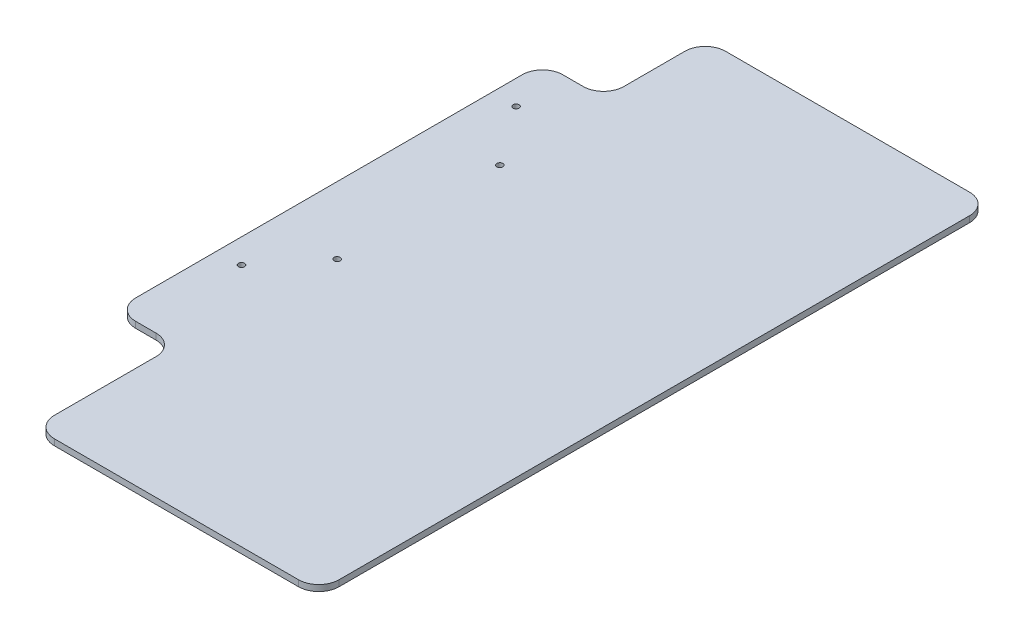
ISO-10303-21;
HEADER;
FILE_DESCRIPTION(('STEP AP214'),'2;1');
FILE_NAME('part.step','',(''),(''),'','','');
FILE_SCHEMA(('AUTOMOTIVE_DESIGN { 1 0 10303 214 1 1 1 1 }'));
ENDSEC;
DATA;
#1=APPLICATION_CONTEXT('core data for automotive mechanical design processes');
#2=APPLICATION_PROTOCOL_DEFINITION('international standard','automotive_design',2000,#1);
#3=PRODUCT_CONTEXT('',#1,'mechanical');
#4=PRODUCT('Part','Part','',(#3));
#5=PRODUCT_RELATED_PRODUCT_CATEGORY('part','',(#4));
#6=PRODUCT_DEFINITION_FORMATION('','',#4);
#7=PRODUCT_DEFINITION_CONTEXT('part definition',#1,'design');
#8=PRODUCT_DEFINITION('design','',#6,#7);
#9=PRODUCT_DEFINITION_SHAPE('','',#8);
#10=(LENGTH_UNIT() NAMED_UNIT(*) SI_UNIT(.MILLI.,.METRE.));
#11=(NAMED_UNIT(*) PLANE_ANGLE_UNIT() SI_UNIT($,.RADIAN.));
#12=(NAMED_UNIT(*) SI_UNIT($,.STERADIAN.) SOLID_ANGLE_UNIT());
#13=UNCERTAINTY_MEASURE_WITH_UNIT(LENGTH_MEASURE(1.E-05),#10,'distance_accuracy_value','');
#14=(GEOMETRIC_REPRESENTATION_CONTEXT(3) GLOBAL_UNCERTAINTY_ASSIGNED_CONTEXT((#13)) GLOBAL_UNIT_ASSIGNED_CONTEXT((#10,
#11,#12)) REPRESENTATION_CONTEXT('',''));
#15=CARTESIAN_POINT('',(0.,0.,0.));
#16=DIRECTION('',(0.,0.,1.));
#17=DIRECTION('',(1.,0.,0.));
#18=AXIS2_PLACEMENT_3D('',#15,#16,#17);
#19=CARTESIAN_POINT('',(0.,3.,-220.));
#20=DIRECTION('',(0.,0.,1.));
#21=DIRECTION('',(1.,0.,0.));
#22=AXIS2_PLACEMENT_3D('',#19,#20,#21);
#23=PLANE('',#22);
#24=DIRECTION('',(-1.,0.,0.));
#25=VECTOR('',#24,1.);
#26=CARTESIAN_POINT('',(0.,0.,-220.));
#27=LINE('',#26,#25);
#28=CARTESIAN_POINT('',(20.,0.,-220.));
#29=VERTEX_POINT('',#28);
#30=CARTESIAN_POINT('',(10.,0.,-220.));
#31=VERTEX_POINT('',#30);
#32=EDGE_CURVE('E236',#29,#31,#27,.T.);
#33=ORIENTED_EDGE('',*,*,#32,.T.);
#34=DIRECTION('',(0.,-1.,0.));
#35=VECTOR('',#34,1.);
#36=CARTESIAN_POINT('',(10.,3.,-220.));
#37=LINE('',#36,#35);
#38=CARTESIAN_POINT('',(10.,3.,-220.));
#39=VERTEX_POINT('',#38);
#40=EDGE_CURVE('E201',#31,#39,#37,.F.);
#41=ORIENTED_EDGE('',*,*,#40,.T.);
#42=DIRECTION('',(-1.,0.,0.));
#43=VECTOR('',#42,1.);
#44=CARTESIAN_POINT('',(0.,3.,-220.));
#45=LINE('',#44,#43);
#46=CARTESIAN_POINT('',(20.,3.,-220.));
#47=VERTEX_POINT('',#46);
#48=EDGE_CURVE('E161',#47,#39,#45,.T.);
#49=ORIENTED_EDGE('',*,*,#48,.F.);
#50=DIRECTION('',(0.,1.,0.));
#51=VECTOR('',#50,1.);
#52=CARTESIAN_POINT('',(20.,3.,-220.));
#53=LINE('',#52,#51);
#54=EDGE_CURVE('E199',#47,#29,#53,.F.);
#55=ORIENTED_EDGE('',*,*,#54,.T.);
#56=EDGE_LOOP('',(#33,#41,#49,#55));
#57=FACE_BOUND('',#56,.T.);
#58=ADVANCED_FACE('F35',(#57),#23,.F.);
#59=CARTESIAN_POINT('',(0.,3.,0.));
#60=DIRECTION('',(1.,0.,0.));
#61=DIRECTION('',(0.,0.,-1.));
#62=AXIS2_PLACEMENT_3D('',#59,#60,#61);
#63=PLANE('',#62);
#64=DIRECTION('',(0.,0.,1.));
#65=VECTOR('',#64,1.);
#66=CARTESIAN_POINT('',(0.,0.,0.));
#67=LINE('',#66,#65);
#68=CARTESIAN_POINT('',(0.,0.,-210.));
#69=VERTEX_POINT('',#68);
#70=CARTESIAN_POINT('',(0.,0.,-20.));
#71=VERTEX_POINT('',#70);
#72=EDGE_CURVE('E273',#69,#71,#67,.T.);
#73=ORIENTED_EDGE('',*,*,#72,.T.);
#74=DIRECTION('',(0.,1.,0.));
#75=VECTOR('',#74,1.);
#76=CARTESIAN_POINT('',(0.,3.,-20.));
#77=LINE('',#76,#75);
#78=CARTESIAN_POINT('',(0.,3.,-20.));
#79=VERTEX_POINT('',#78);
#80=EDGE_CURVE('E196',#71,#79,#77,.T.);
#81=ORIENTED_EDGE('',*,*,#80,.T.);
#82=DIRECTION('',(0.,0.,1.));
#83=VECTOR('',#82,1.);
#84=CARTESIAN_POINT('',(0.,3.,0.));
#85=LINE('',#84,#83);
#86=CARTESIAN_POINT('',(0.,3.,-210.));
#87=VERTEX_POINT('',#86);
#88=EDGE_CURVE('E276',#87,#79,#85,.T.);
#89=ORIENTED_EDGE('',*,*,#88,.F.);
#90=DIRECTION('',(0.,-1.,0.));
#91=VECTOR('',#90,1.);
#92=CARTESIAN_POINT('',(0.,3.,-210.));
#93=LINE('',#92,#91);
#94=EDGE_CURVE('E193',#87,#69,#93,.T.);
#95=ORIENTED_EDGE('',*,*,#94,.T.);
#96=EDGE_LOOP('',(#73,#81,#89,#95));
#97=FACE_BOUND('',#96,.T.);
#98=ADVANCED_FACE('F313',(#97),#63,.F.);
#99=CARTESIAN_POINT('',(170.,3.,0.));
#100=DIRECTION('',(-1.,0.,0.));
#101=DIRECTION('',(0.,0.,1.));
#102=AXIS2_PLACEMENT_3D('',#99,#100,#101);
#103=PLANE('',#102);
#104=DIRECTION('',(0.,0.,-1.));
#105=VECTOR('',#104,1.);
#106=CARTESIAN_POINT('',(170.,3.,0.));
#107=LINE('',#106,#105);
#108=CARTESIAN_POINT('',(170.,3.,50.));
#109=VERTEX_POINT('',#108);
#110=CARTESIAN_POINT('',(170.,3.,-260.));
#111=VERTEX_POINT('',#110);
#112=EDGE_CURVE('E230',#109,#111,#107,.T.);
#113=ORIENTED_EDGE('',*,*,#112,.F.);
#114=DIRECTION('',(0.,1.,0.));
#115=VECTOR('',#114,1.);
#116=CARTESIAN_POINT('',(170.,0.,50.));
#117=LINE('',#116,#115);
#118=CARTESIAN_POINT('',(170.,0.,50.));
#119=VERTEX_POINT('',#118);
#120=EDGE_CURVE('E303',#109,#119,#117,.F.);
#121=ORIENTED_EDGE('',*,*,#120,.T.);
#122=DIRECTION('',(0.,0.,-1.));
#123=VECTOR('',#122,1.);
#124=CARTESIAN_POINT('',(170.,0.,0.));
#125=LINE('',#124,#123);
#126=CARTESIAN_POINT('',(170.,0.,-260.));
#127=VERTEX_POINT('',#126);
#128=EDGE_CURVE('E283',#119,#127,#125,.T.);
#129=ORIENTED_EDGE('',*,*,#128,.T.);
#130=DIRECTION('',(0.,1.,0.));
#131=VECTOR('',#130,1.);
#132=CARTESIAN_POINT('',(170.,3.,-260.));
#133=LINE('',#132,#131);
#134=EDGE_CURVE('E300',#127,#111,#133,.T.);
#135=ORIENTED_EDGE('',*,*,#134,.T.);
#136=EDGE_LOOP('',(#113,#121,#129,#135));
#137=FACE_BOUND('',#136,.T.);
#138=ADVANCED_FACE('F345',(#137),#103,.F.);
#139=CARTESIAN_POINT('',(0.,3.,0.));
#140=DIRECTION('',(0.,-1.,0.));
#141=DIRECTION('',(0.,0.,-1.));
#142=AXIS2_PLACEMENT_3D('',#139,#140,#141);
#143=PLANE('',#142);
#144=CARTESIAN_POINT('',(12.,3.,-60.));
#145=DIRECTION('',(0.,1.,0.));
#146=DIRECTION('',(0.,0.,1.));
#147=AXIS2_PLACEMENT_3D('',#144,#145,#146);
#148=CIRCLE('',#147,1.5);
#149=CARTESIAN_POINT('',(12.,3.,-58.5));
#150=VERTEX_POINT('',#149);
#151=EDGE_CURVE('E250',#150,#150,#148,.T.);
#152=ORIENTED_EDGE('',*,*,#151,.F.);
#153=EDGE_LOOP('',(#152));
#154=FACE_BOUND('',#153,.T.);
#155=CARTESIAN_POINT('',(12.,3.,-195.));
#156=DIRECTION('',(0.,1.,0.));
#157=DIRECTION('',(0.,0.,1.));
#158=AXIS2_PLACEMENT_3D('',#155,#156,#157);
#159=CIRCLE('',#158,1.5);
#160=CARTESIAN_POINT('',(12.,3.,-193.5));
#161=VERTEX_POINT('',#160);
#162=EDGE_CURVE('E255',#161,#161,#159,.T.);
#163=ORIENTED_EDGE('',*,*,#162,.F.);
#164=EDGE_LOOP('',(#163));
#165=FACE_BOUND('',#164,.T.);
#166=CARTESIAN_POINT('',(32.999999999999,3.,-166.000000000001));
#167=DIRECTION('',(0.,1.,0.));
#168=DIRECTION('',(0.,0.,1.));
#169=AXIS2_PLACEMENT_3D('',#166,#167,#168);
#170=CIRCLE('',#169,1.5);
#171=CARTESIAN_POINT('',(32.999999999999,3.,-164.500000000001));
#172=VERTEX_POINT('',#171);
#173=EDGE_CURVE('E261',#172,#172,#170,.T.);
#174=ORIENTED_EDGE('',*,*,#173,.F.);
#175=EDGE_LOOP('',(#174));
#176=FACE_BOUND('',#175,.T.);
#177=CARTESIAN_POINT('',(32.9999999999993,3.,-86.0000000000005));
#178=DIRECTION('',(0.,1.,0.));
#179=DIRECTION('',(0.,0.,1.));
#180=AXIS2_PLACEMENT_3D('',#177,#178,#179);
#181=CIRCLE('',#180,1.49999999999987);
#182=CARTESIAN_POINT('',(32.9999999999993,3.,-84.5000000000006));
#183=VERTEX_POINT('',#182);
#184=EDGE_CURVE('E267',#183,#183,#181,.T.);
#185=ORIENTED_EDGE('',*,*,#184,.F.);
#186=EDGE_LOOP('',(#185));
#187=FACE_BOUND('',#186,.T.);
#188=DIRECTION('',(1.,0.,0.));
#189=VECTOR('',#188,1.);
#190=CARTESIAN_POINT('',(170.,3.,60.));
#191=LINE('',#190,#189);
#192=CARTESIAN_POINT('',(40.,3.,60.));
#193=VERTEX_POINT('',#192);
#194=CARTESIAN_POINT('',(160.,3.,60.));
#195=VERTEX_POINT('',#194);
#196=EDGE_CURVE('E157',#193,#195,#191,.T.);
#197=ORIENTED_EDGE('',*,*,#196,.T.);
#198=CARTESIAN_POINT('',(160.,3.,50.));
#199=DIRECTION('',(0.,-1.,0.));
#200=DIRECTION('',(0.,0.,-1.));
#201=AXIS2_PLACEMENT_3D('',#198,#199,#200);
#202=CIRCLE('',#201,10.);
#203=EDGE_CURVE('E298',#195,#109,#202,.F.);
#204=ORIENTED_EDGE('',*,*,#203,.T.);
#205=ORIENTED_EDGE('',*,*,#112,.T.);
#206=CARTESIAN_POINT('',(160.,3.,-260.));
#207=DIRECTION('',(0.,-1.,0.));
#208=DIRECTION('',(0.,0.,-1.));
#209=AXIS2_PLACEMENT_3D('',#206,#207,#208);
#210=CIRCLE('',#209,10.);
#211=CARTESIAN_POINT('',(160.,3.,-270.));
#212=VERTEX_POINT('',#211);
#213=EDGE_CURVE('E288',#111,#212,#210,.F.);
#214=ORIENTED_EDGE('',*,*,#213,.T.);
#215=DIRECTION('',(-1.,0.,0.));
#216=VECTOR('',#215,1.);
#217=CARTESIAN_POINT('',(170.,3.,-270.));
#218=LINE('',#217,#216);
#219=CARTESIAN_POINT('',(40.,3.,-270.));
#220=VERTEX_POINT('',#219);
#221=EDGE_CURVE('E171',#212,#220,#218,.T.);
#222=ORIENTED_EDGE('',*,*,#221,.T.);
#223=CARTESIAN_POINT('',(40.,3.,-260.));
#224=DIRECTION('',(0.,-1.,0.));
#225=DIRECTION('',(0.,0.,-1.));
#226=AXIS2_PLACEMENT_3D('',#223,#224,#225);
#227=CIRCLE('',#226,10.);
#228=CARTESIAN_POINT('',(30.,3.,-260.));
#229=VERTEX_POINT('',#228);
#230=EDGE_CURVE('E290',#220,#229,#227,.F.);
#231=ORIENTED_EDGE('',*,*,#230,.T.);
#232=DIRECTION('',(0.,0.,1.));
#233=VECTOR('',#232,1.);
#234=CARTESIAN_POINT('',(30.,3.,-220.));
#235=LINE('',#234,#233);
#236=CARTESIAN_POINT('',(30.,3.,-230.));
#237=VERTEX_POINT('',#236);
#238=EDGE_CURVE('E222',#229,#237,#235,.T.);
#239=ORIENTED_EDGE('',*,*,#238,.T.);
#240=CARTESIAN_POINT('',(20.,3.,-230.));
#241=DIRECTION('',(0.,-1.,0.));
#242=DIRECTION('',(0.,0.,-1.));
#243=AXIS2_PLACEMENT_3D('',#240,#241,#242);
#244=CIRCLE('',#243,10.);
#245=EDGE_CURVE('E43',#237,#47,#244,.T.);
#246=ORIENTED_EDGE('',*,*,#245,.T.);
#247=ORIENTED_EDGE('',*,*,#48,.T.);
#248=CARTESIAN_POINT('',(10.,3.,-210.));
#249=DIRECTION('',(0.,-1.,0.));
#250=DIRECTION('',(0.,0.,-1.));
#251=AXIS2_PLACEMENT_3D('',#248,#249,#250);
#252=CIRCLE('',#251,10.);
#253=EDGE_CURVE('E292',#39,#87,#252,.F.);
#254=ORIENTED_EDGE('',*,*,#253,.T.);
#255=ORIENTED_EDGE('',*,*,#88,.T.);
#256=CARTESIAN_POINT('',(10.,3.,-20.));
#257=DIRECTION('',(0.,-1.,0.));
#258=DIRECTION('',(0.,0.,-1.));
#259=AXIS2_PLACEMENT_3D('',#256,#257,#258);
#260=CIRCLE('',#259,10.);
#261=CARTESIAN_POINT('',(10.,3.,-10.));
#262=VERTEX_POINT('',#261);
#263=EDGE_CURVE('E294',#79,#262,#260,.F.);
#264=ORIENTED_EDGE('',*,*,#263,.T.);
#265=DIRECTION('',(-1.,0.,0.));
#266=VECTOR('',#265,1.);
#267=CARTESIAN_POINT('',(0.,3.,-10.));
#268=LINE('',#267,#266);
#269=CARTESIAN_POINT('',(20.,3.,-10.));
#270=VERTEX_POINT('',#269);
#271=EDGE_CURVE('E240',#270,#262,#268,.T.);
#272=ORIENTED_EDGE('',*,*,#271,.F.);
#273=CARTESIAN_POINT('',(20.,3.,0.));
#274=DIRECTION('',(0.,-1.,0.));
#275=DIRECTION('',(0.,0.,-1.));
#276=AXIS2_PLACEMENT_3D('',#273,#274,#275);
#277=CIRCLE('',#276,10.);
#278=CARTESIAN_POINT('',(30.,3.,0.));
#279=VERTEX_POINT('',#278);
#280=EDGE_CURVE('E212',#270,#279,#277,.T.);
#281=ORIENTED_EDGE('',*,*,#280,.T.);
#282=DIRECTION('',(0.,0.,1.));
#283=VECTOR('',#282,1.);
#284=CARTESIAN_POINT('',(30.,3.,-9.99999999999998));
#285=LINE('',#284,#283);
#286=CARTESIAN_POINT('',(30.,3.,50.));
#287=VERTEX_POINT('',#286);
#288=EDGE_CURVE('E330',#279,#287,#285,.T.);
#289=ORIENTED_EDGE('',*,*,#288,.T.);
#290=CARTESIAN_POINT('',(40.,3.,50.));
#291=DIRECTION('',(0.,-1.,0.));
#292=DIRECTION('',(0.,0.,-1.));
#293=AXIS2_PLACEMENT_3D('',#290,#291,#292);
#294=CIRCLE('',#293,10.);
#295=EDGE_CURVE('E296',#287,#193,#294,.F.);
#296=ORIENTED_EDGE('',*,*,#295,.T.);
#297=EDGE_LOOP('',(#197,#204,#205,#214,#222,#231,#239,#246,#247,#254,#255,#264,#272,#281,#289,#296));
#298=FACE_BOUND('',#297,.T.);
#299=ADVANCED_FACE('F219',(#154,#165,#176,#187,#298),#143,.F.);
#300=CARTESIAN_POINT('',(0.,0.,0.));
#301=DIRECTION('',(0.,-1.,0.));
#302=DIRECTION('',(0.,0.,-1.));
#303=AXIS2_PLACEMENT_3D('',#300,#301,#302);
#304=PLANE('',#303);
#305=ORIENTED_EDGE('',*,*,#128,.F.);
#306=CARTESIAN_POINT('',(160.,0.,50.));
#307=DIRECTION('',(0.,-1.,0.));
#308=DIRECTION('',(0.,0.,-1.));
#309=AXIS2_PLACEMENT_3D('',#306,#307,#308);
#310=CIRCLE('',#309,10.);
#311=CARTESIAN_POINT('',(160.,0.,60.));
#312=VERTEX_POINT('',#311);
#313=EDGE_CURVE('E170',#119,#312,#310,.T.);
#314=ORIENTED_EDGE('',*,*,#313,.T.);
#315=DIRECTION('',(1.,0.,0.));
#316=VECTOR('',#315,1.);
#317=CARTESIAN_POINT('',(170.,0.,60.));
#318=LINE('',#317,#316);
#319=CARTESIAN_POINT('',(40.,0.,60.));
#320=VERTEX_POINT('',#319);
#321=EDGE_CURVE('E154',#320,#312,#318,.T.);
#322=ORIENTED_EDGE('',*,*,#321,.F.);
#323=CARTESIAN_POINT('',(40.,0.,50.));
#324=DIRECTION('',(0.,-1.,0.));
#325=DIRECTION('',(0.,0.,-1.));
#326=AXIS2_PLACEMENT_3D('',#323,#324,#325);
#327=CIRCLE('',#326,10.);
#328=CARTESIAN_POINT('',(30.,0.,50.));
#329=VERTEX_POINT('',#328);
#330=EDGE_CURVE('E167',#320,#329,#327,.T.);
#331=ORIENTED_EDGE('',*,*,#330,.T.);
#332=DIRECTION('',(0.,0.,1.));
#333=VECTOR('',#332,1.);
#334=CARTESIAN_POINT('',(30.,0.,-9.99999999999998));
#335=LINE('',#334,#333);
#336=CARTESIAN_POINT('',(30.,0.,0.));
#337=VERTEX_POINT('',#336);
#338=EDGE_CURVE('E172',#337,#329,#335,.T.);
#339=ORIENTED_EDGE('',*,*,#338,.F.);
#340=CARTESIAN_POINT('',(20.,0.,0.));
#341=DIRECTION('',(0.,-1.,0.));
#342=DIRECTION('',(0.,0.,-1.));
#343=AXIS2_PLACEMENT_3D('',#340,#341,#342);
#344=CIRCLE('',#343,10.);
#345=CARTESIAN_POINT('',(20.,0.,-10.));
#346=VERTEX_POINT('',#345);
#347=EDGE_CURVE('E214',#337,#346,#344,.F.);
#348=ORIENTED_EDGE('',*,*,#347,.T.);
#349=DIRECTION('',(-1.,0.,0.));
#350=VECTOR('',#349,1.);
#351=CARTESIAN_POINT('',(0.,0.,-10.));
#352=LINE('',#351,#350);
#353=CARTESIAN_POINT('',(10.,0.,-10.));
#354=VERTEX_POINT('',#353);
#355=EDGE_CURVE('E244',#346,#354,#352,.T.);
#356=ORIENTED_EDGE('',*,*,#355,.T.);
#357=CARTESIAN_POINT('',(10.,0.,-20.));
#358=DIRECTION('',(0.,-1.,0.));
#359=DIRECTION('',(0.,0.,-1.));
#360=AXIS2_PLACEMENT_3D('',#357,#358,#359);
#361=CIRCLE('',#360,10.);
#362=EDGE_CURVE('E178',#354,#71,#361,.T.);
#363=ORIENTED_EDGE('',*,*,#362,.T.);
#364=ORIENTED_EDGE('',*,*,#72,.F.);
#365=CARTESIAN_POINT('',(10.,0.,-210.));
#366=DIRECTION('',(0.,-1.,0.));
#367=DIRECTION('',(0.,0.,-1.));
#368=AXIS2_PLACEMENT_3D('',#365,#366,#367);
#369=CIRCLE('',#368,10.);
#370=EDGE_CURVE('E182',#69,#31,#369,.T.);
#371=ORIENTED_EDGE('',*,*,#370,.T.);
#372=ORIENTED_EDGE('',*,*,#32,.F.);
#373=CARTESIAN_POINT('',(20.,0.,-230.));
#374=DIRECTION('',(0.,-1.,0.));
#375=DIRECTION('',(0.,0.,-1.));
#376=AXIS2_PLACEMENT_3D('',#373,#374,#375);
#377=CIRCLE('',#376,10.);
#378=CARTESIAN_POINT('',(30.,0.,-230.));
#379=VERTEX_POINT('',#378);
#380=EDGE_CURVE('E11',#29,#379,#377,.F.);
#381=ORIENTED_EDGE('',*,*,#380,.T.);
#382=DIRECTION('',(0.,0.,1.));
#383=VECTOR('',#382,1.);
#384=CARTESIAN_POINT('',(30.,0.,-220.));
#385=LINE('',#384,#383);
#386=CARTESIAN_POINT('',(30.,0.,-260.));
#387=VERTEX_POINT('',#386);
#388=EDGE_CURVE('E235',#387,#379,#385,.T.);
#389=ORIENTED_EDGE('',*,*,#388,.F.);
#390=CARTESIAN_POINT('',(40.,0.,-260.));
#391=DIRECTION('',(0.,-1.,0.));
#392=DIRECTION('',(0.,0.,-1.));
#393=AXIS2_PLACEMENT_3D('',#390,#391,#392);
#394=CIRCLE('',#393,10.);
#395=CARTESIAN_POINT('',(40.,0.,-270.));
#396=VERTEX_POINT('',#395);
#397=EDGE_CURVE('E50',#387,#396,#394,.T.);
#398=ORIENTED_EDGE('',*,*,#397,.T.);
#399=DIRECTION('',(-1.,0.,0.));
#400=VECTOR('',#399,1.);
#401=CARTESIAN_POINT('',(170.,0.,-270.));
#402=LINE('',#401,#400);
#403=CARTESIAN_POINT('',(160.,0.,-270.));
#404=VERTEX_POINT('',#403);
#405=EDGE_CURVE('E241',#404,#396,#402,.T.);
#406=ORIENTED_EDGE('',*,*,#405,.F.);
#407=CARTESIAN_POINT('',(160.,0.,-260.));
#408=DIRECTION('',(0.,-1.,0.));
#409=DIRECTION('',(0.,0.,-1.));
#410=AXIS2_PLACEMENT_3D('',#407,#408,#409);
#411=CIRCLE('',#410,10.);
#412=EDGE_CURVE('E305',#404,#127,#411,.T.);
#413=ORIENTED_EDGE('',*,*,#412,.T.);
#414=EDGE_LOOP('',(#305,#314,#322,#331,#339,#348,#356,#363,#364,#371,#372,#381,#389,#398,#406,#413));
#415=FACE_BOUND('',#414,.T.);
#416=CARTESIAN_POINT('',(12.,0.,-60.));
#417=DIRECTION('',(0.,1.,0.));
#418=DIRECTION('',(0.,0.,1.));
#419=AXIS2_PLACEMENT_3D('',#416,#417,#418);
#420=CIRCLE('',#419,1.5);
#421=CARTESIAN_POINT('',(12.,0.,-58.5));
#422=VERTEX_POINT('',#421);
#423=EDGE_CURVE('E252',#422,#422,#420,.T.);
#424=ORIENTED_EDGE('',*,*,#423,.T.);
#425=EDGE_LOOP('',(#424));
#426=FACE_BOUND('',#425,.T.);
#427=CARTESIAN_POINT('',(12.,0.,-195.));
#428=DIRECTION('',(0.,1.,0.));
#429=DIRECTION('',(0.,0.,1.));
#430=AXIS2_PLACEMENT_3D('',#427,#428,#429);
#431=CIRCLE('',#430,1.5);
#432=CARTESIAN_POINT('',(12.,0.,-193.5));
#433=VERTEX_POINT('',#432);
#434=EDGE_CURVE('E258',#433,#433,#431,.T.);
#435=ORIENTED_EDGE('',*,*,#434,.T.);
#436=EDGE_LOOP('',(#435));
#437=FACE_BOUND('',#436,.T.);
#438=CARTESIAN_POINT('',(32.999999999999,0.,-166.000000000001));
#439=DIRECTION('',(0.,1.,0.));
#440=DIRECTION('',(0.,0.,1.));
#441=AXIS2_PLACEMENT_3D('',#438,#439,#440);
#442=CIRCLE('',#441,1.5);
#443=CARTESIAN_POINT('',(32.999999999999,0.,-164.500000000001));
#444=VERTEX_POINT('',#443);
#445=EDGE_CURVE('E264',#444,#444,#442,.T.);
#446=ORIENTED_EDGE('',*,*,#445,.T.);
#447=EDGE_LOOP('',(#446));
#448=FACE_BOUND('',#447,.T.);
#449=CARTESIAN_POINT('',(32.9999999999993,0.,-86.0000000000005));
#450=DIRECTION('',(0.,1.,0.));
#451=DIRECTION('',(0.,0.,1.));
#452=AXIS2_PLACEMENT_3D('',#449,#450,#451);
#453=CIRCLE('',#452,1.49999999999987);
#454=CARTESIAN_POINT('',(32.9999999999993,0.,-84.5000000000006));
#455=VERTEX_POINT('',#454);
#456=EDGE_CURVE('E270',#455,#455,#453,.T.);
#457=ORIENTED_EDGE('',*,*,#456,.T.);
#458=EDGE_LOOP('',(#457));
#459=FACE_BOUND('',#458,.T.);
#460=ADVANCED_FACE('F164',(#415,#426,#437,#448,#459),#304,.T.);
#461=CARTESIAN_POINT('',(32.9999999999993,0.,-86.0000000000005));
#462=DIRECTION('',(0.,1.,0.));
#463=DIRECTION('',(0.,0.,1.));
#464=AXIS2_PLACEMENT_3D('',#461,#462,#463);
#465=CYLINDRICAL_SURFACE('',#464,1.49999999999987);
#466=ORIENTED_EDGE('',*,*,#456,.F.);
#467=EDGE_LOOP('',(#466));
#468=FACE_BOUND('',#467,.T.);
#469=ORIENTED_EDGE('',*,*,#184,.T.);
#470=EDGE_LOOP('',(#469));
#471=FACE_BOUND('',#470,.T.);
#472=ADVANCED_FACE('F376',(#468,#471),#465,.F.);
#473=CARTESIAN_POINT('',(32.999999999999,0.,-166.000000000001));
#474=DIRECTION('',(0.,1.,0.));
#475=DIRECTION('',(0.,0.,1.));
#476=AXIS2_PLACEMENT_3D('',#473,#474,#475);
#477=CYLINDRICAL_SURFACE('',#476,1.5);
#478=ORIENTED_EDGE('',*,*,#445,.F.);
#479=EDGE_LOOP('',(#478));
#480=FACE_BOUND('',#479,.T.);
#481=ORIENTED_EDGE('',*,*,#173,.T.);
#482=EDGE_LOOP('',(#481));
#483=FACE_BOUND('',#482,.T.);
#484=ADVANCED_FACE('F382',(#480,#483),#477,.F.);
#485=CARTESIAN_POINT('',(12.,0.,-195.));
#486=DIRECTION('',(0.,1.,0.));
#487=DIRECTION('',(0.,0.,1.));
#488=AXIS2_PLACEMENT_3D('',#485,#486,#487);
#489=CYLINDRICAL_SURFACE('',#488,1.5);
#490=ORIENTED_EDGE('',*,*,#434,.F.);
#491=EDGE_LOOP('',(#490));
#492=FACE_BOUND('',#491,.T.);
#493=ORIENTED_EDGE('',*,*,#162,.T.);
#494=EDGE_LOOP('',(#493));
#495=FACE_BOUND('',#494,.T.);
#496=ADVANCED_FACE('F386',(#492,#495),#489,.F.);
#497=CARTESIAN_POINT('',(12.,0.,-60.));
#498=DIRECTION('',(0.,1.,0.));
#499=DIRECTION('',(0.,0.,1.));
#500=AXIS2_PLACEMENT_3D('',#497,#498,#499);
#501=CYLINDRICAL_SURFACE('',#500,1.5);
#502=ORIENTED_EDGE('',*,*,#423,.F.);
#503=EDGE_LOOP('',(#502));
#504=FACE_BOUND('',#503,.T.);
#505=ORIENTED_EDGE('',*,*,#151,.T.);
#506=EDGE_LOOP('',(#505));
#507=FACE_BOUND('',#506,.T.);
#508=ADVANCED_FACE('F390',(#504,#507),#501,.F.);
#509=CARTESIAN_POINT('',(0.,0.,-10.));
#510=DIRECTION('',(0.,0.,-1.));
#511=DIRECTION('',(-1.,0.,0.));
#512=AXIS2_PLACEMENT_3D('',#509,#510,#511);
#513=PLANE('',#512);
#514=ORIENTED_EDGE('',*,*,#355,.F.);
#515=DIRECTION('',(0.,1.,0.));
#516=VECTOR('',#515,1.);
#517=CARTESIAN_POINT('',(20.,0.,-10.));
#518=LINE('',#517,#516);
#519=EDGE_CURVE('E187',#346,#270,#518,.T.);
#520=ORIENTED_EDGE('',*,*,#519,.T.);
#521=ORIENTED_EDGE('',*,*,#271,.T.);
#522=DIRECTION('',(0.,1.,0.));
#523=VECTOR('',#522,1.);
#524=CARTESIAN_POINT('',(10.,0.,-10.));
#525=LINE('',#524,#523);
#526=EDGE_CURVE('E180',#262,#354,#525,.F.);
#527=ORIENTED_EDGE('',*,*,#526,.T.);
#528=EDGE_LOOP('',(#514,#520,#521,#527));
#529=FACE_BOUND('',#528,.T.);
#530=ADVANCED_FACE('F322',(#529),#513,.F.);
#531=CARTESIAN_POINT('',(170.,-156.524758424985,-270.));
#532=DIRECTION('',(0.,0.,-1.));
#533=DIRECTION('',(-1.,0.,0.));
#534=AXIS2_PLACEMENT_3D('',#531,#532,#533);
#535=PLANE('',#534);
#536=ORIENTED_EDGE('',*,*,#405,.T.);
#537=DIRECTION('',(0.,1.,0.));
#538=VECTOR('',#537,1.);
#539=CARTESIAN_POINT('',(40.,-156.524758424985,-270.));
#540=LINE('',#539,#538);
#541=EDGE_CURVE('E209',#396,#220,#540,.T.);
#542=ORIENTED_EDGE('',*,*,#541,.T.);
#543=ORIENTED_EDGE('',*,*,#221,.F.);
#544=DIRECTION('',(0.,1.,0.));
#545=VECTOR('',#544,1.);
#546=CARTESIAN_POINT('',(160.,0.,-270.));
#547=LINE('',#546,#545);
#548=EDGE_CURVE('E57',#212,#404,#547,.F.);
#549=ORIENTED_EDGE('',*,*,#548,.T.);
#550=EDGE_LOOP('',(#536,#542,#543,#549));
#551=FACE_BOUND('',#550,.T.);
#552=ADVANCED_FACE('F338',(#551),#535,.T.);
#553=CARTESIAN_POINT('',(30.,-156.524758424985,-220.));
#554=DIRECTION('',(-1.,0.,0.));
#555=DIRECTION('',(0.,0.,1.));
#556=AXIS2_PLACEMENT_3D('',#553,#554,#555);
#557=PLANE('',#556);
#558=ORIENTED_EDGE('',*,*,#388,.T.);
#559=DIRECTION('',(0.,1.,0.));
#560=VECTOR('',#559,1.);
#561=CARTESIAN_POINT('',(30.,-156.524758424985,-230.));
#562=LINE('',#561,#560);
#563=EDGE_CURVE('E205',#379,#237,#562,.T.);
#564=ORIENTED_EDGE('',*,*,#563,.T.);
#565=ORIENTED_EDGE('',*,*,#238,.F.);
#566=DIRECTION('',(0.,1.,0.));
#567=VECTOR('',#566,1.);
#568=CARTESIAN_POINT('',(30.,-156.524758424985,-260.));
#569=LINE('',#568,#567);
#570=EDGE_CURVE('E203',#229,#387,#569,.F.);
#571=ORIENTED_EDGE('',*,*,#570,.T.);
#572=EDGE_LOOP('',(#558,#564,#565,#571));
#573=FACE_BOUND('',#572,.T.);
#574=ADVANCED_FACE('F238',(#573),#557,.T.);
#575=CARTESIAN_POINT('',(30.,-156.524758424985,-9.99999999999998));
#576=DIRECTION('',(-1.,0.,0.));
#577=DIRECTION('',(0.,0.,1.));
#578=AXIS2_PLACEMENT_3D('',#575,#576,#577);
#579=PLANE('',#578);
#580=ORIENTED_EDGE('',*,*,#288,.F.);
#581=DIRECTION('',(0.,1.,0.));
#582=VECTOR('',#581,1.);
#583=CARTESIAN_POINT('',(30.,-156.524758424985,0.));
#584=LINE('',#583,#582);
#585=EDGE_CURVE('E191',#279,#337,#584,.F.);
#586=ORIENTED_EDGE('',*,*,#585,.T.);
#587=ORIENTED_EDGE('',*,*,#338,.T.);
#588=DIRECTION('',(0.,1.,0.));
#589=VECTOR('',#588,1.);
#590=CARTESIAN_POINT('',(30.,-156.524758424985,50.));
#591=LINE('',#590,#589);
#592=EDGE_CURVE('E177',#329,#287,#591,.T.);
#593=ORIENTED_EDGE('',*,*,#592,.T.);
#594=EDGE_LOOP('',(#580,#586,#587,#593));
#595=FACE_BOUND('',#594,.T.);
#596=ADVANCED_FACE('F332',(#595),#579,.T.);
#597=CARTESIAN_POINT('',(170.,-156.524758424985,60.));
#598=DIRECTION('',(0.,0.,1.));
#599=DIRECTION('',(1.,0.,0.));
#600=AXIS2_PLACEMENT_3D('',#597,#598,#599);
#601=PLANE('',#600);
#602=ORIENTED_EDGE('',*,*,#321,.T.);
#603=DIRECTION('',(0.,1.,0.));
#604=VECTOR('',#603,1.);
#605=CARTESIAN_POINT('',(160.,3.,60.));
#606=LINE('',#605,#604);
#607=EDGE_CURVE('E160',#312,#195,#606,.T.);
#608=ORIENTED_EDGE('',*,*,#607,.T.);
#609=ORIENTED_EDGE('',*,*,#196,.F.);
#610=DIRECTION('',(0.,1.,0.));
#611=VECTOR('',#610,1.);
#612=CARTESIAN_POINT('',(40.,-156.524758424985,60.));
#613=LINE('',#612,#611);
#614=EDGE_CURVE('E150',#193,#320,#613,.F.);
#615=ORIENTED_EDGE('',*,*,#614,.T.);
#616=EDGE_LOOP('',(#602,#608,#609,#615));
#617=FACE_BOUND('',#616,.T.);
#618=ADVANCED_FACE('F152',(#617),#601,.T.);
#619=CARTESIAN_POINT('',(160.,-156.524758424985,50.));
#620=DIRECTION('',(0.,-1.,0.));
#621=DIRECTION('',(0.,0.,-1.));
#622=AXIS2_PLACEMENT_3D('',#619,#620,#621);
#623=CYLINDRICAL_SURFACE('',#622,10.);
#624=ORIENTED_EDGE('',*,*,#313,.F.);
#625=ORIENTED_EDGE('',*,*,#120,.F.);
#626=ORIENTED_EDGE('',*,*,#203,.F.);
#627=ORIENTED_EDGE('',*,*,#607,.F.);
#628=EDGE_LOOP('',(#624,#625,#626,#627));
#629=FACE_BOUND('',#628,.T.);
#630=ADVANCED_FACE('F348',(#629),#623,.T.);
#631=CARTESIAN_POINT('',(20.,0.,0.));
#632=DIRECTION('',(0.,1.,0.));
#633=DIRECTION('',(0.,0.,1.));
#634=AXIS2_PLACEMENT_3D('',#631,#632,#633);
#635=CYLINDRICAL_SURFACE('',#634,10.);
#636=ORIENTED_EDGE('',*,*,#347,.F.);
#637=ORIENTED_EDGE('',*,*,#585,.F.);
#638=ORIENTED_EDGE('',*,*,#280,.F.);
#639=ORIENTED_EDGE('',*,*,#519,.F.);
#640=EDGE_LOOP('',(#636,#637,#638,#639));
#641=FACE_BOUND('',#640,.T.);
#642=ADVANCED_FACE('F326',(#641),#635,.F.);
#643=CARTESIAN_POINT('',(40.,-156.524758424985,50.));
#644=DIRECTION('',(0.,1.,0.));
#645=DIRECTION('',(0.,0.,1.));
#646=AXIS2_PLACEMENT_3D('',#643,#644,#645);
#647=CYLINDRICAL_SURFACE('',#646,10.);
#648=ORIENTED_EDGE('',*,*,#330,.F.);
#649=ORIENTED_EDGE('',*,*,#614,.F.);
#650=ORIENTED_EDGE('',*,*,#295,.F.);
#651=ORIENTED_EDGE('',*,*,#592,.F.);
#652=EDGE_LOOP('',(#648,#649,#650,#651));
#653=FACE_BOUND('',#652,.T.);
#654=ADVANCED_FACE('F175',(#653),#647,.T.);
#655=CARTESIAN_POINT('',(10.,3.,-20.));
#656=DIRECTION('',(0.,1.,0.));
#657=DIRECTION('',(0.,0.,1.));
#658=AXIS2_PLACEMENT_3D('',#655,#656,#657);
#659=CYLINDRICAL_SURFACE('',#658,10.);
#660=ORIENTED_EDGE('',*,*,#362,.F.);
#661=ORIENTED_EDGE('',*,*,#526,.F.);
#662=ORIENTED_EDGE('',*,*,#263,.F.);
#663=ORIENTED_EDGE('',*,*,#80,.F.);
#664=EDGE_LOOP('',(#660,#661,#662,#663));
#665=FACE_BOUND('',#664,.T.);
#666=ADVANCED_FACE('F317',(#665),#659,.T.);
#667=CARTESIAN_POINT('',(10.,3.,-210.));
#668=DIRECTION('',(0.,-1.,0.));
#669=DIRECTION('',(0.,0.,-1.));
#670=AXIS2_PLACEMENT_3D('',#667,#668,#669);
#671=CYLINDRICAL_SURFACE('',#670,10.);
#672=ORIENTED_EDGE('',*,*,#253,.F.);
#673=ORIENTED_EDGE('',*,*,#40,.F.);
#674=ORIENTED_EDGE('',*,*,#370,.F.);
#675=ORIENTED_EDGE('',*,*,#94,.F.);
#676=EDGE_LOOP('',(#672,#673,#674,#675));
#677=FACE_BOUND('',#676,.T.);
#678=ADVANCED_FACE('F310',(#677),#671,.T.);
#679=CARTESIAN_POINT('',(20.,-156.524758424985,-230.));
#680=DIRECTION('',(0.,1.,0.));
#681=DIRECTION('',(0.,0.,1.));
#682=AXIS2_PLACEMENT_3D('',#679,#680,#681);
#683=CYLINDRICAL_SURFACE('',#682,10.);
#684=ORIENTED_EDGE('',*,*,#380,.F.);
#685=ORIENTED_EDGE('',*,*,#54,.F.);
#686=ORIENTED_EDGE('',*,*,#245,.F.);
#687=ORIENTED_EDGE('',*,*,#563,.F.);
#688=EDGE_LOOP('',(#684,#685,#686,#687));
#689=FACE_BOUND('',#688,.T.);
#690=ADVANCED_FACE('F233',(#689),#683,.F.);
#691=CARTESIAN_POINT('',(40.,-156.524758424985,-260.));
#692=DIRECTION('',(0.,1.,0.));
#693=DIRECTION('',(0.,0.,1.));
#694=AXIS2_PLACEMENT_3D('',#691,#692,#693);
#695=CYLINDRICAL_SURFACE('',#694,10.);
#696=ORIENTED_EDGE('',*,*,#397,.F.);
#697=ORIENTED_EDGE('',*,*,#570,.F.);
#698=ORIENTED_EDGE('',*,*,#230,.F.);
#699=ORIENTED_EDGE('',*,*,#541,.F.);
#700=EDGE_LOOP('',(#696,#697,#698,#699));
#701=FACE_BOUND('',#700,.T.);
#702=ADVANCED_FACE('F453',(#701),#695,.T.);
#703=CARTESIAN_POINT('',(160.,3.,-260.));
#704=DIRECTION('',(0.,-1.,0.));
#705=DIRECTION('',(0.,0.,-1.));
#706=AXIS2_PLACEMENT_3D('',#703,#704,#705);
#707=CYLINDRICAL_SURFACE('',#706,10.);
#708=ORIENTED_EDGE('',*,*,#412,.F.);
#709=ORIENTED_EDGE('',*,*,#548,.F.);
#710=ORIENTED_EDGE('',*,*,#213,.F.);
#711=ORIENTED_EDGE('',*,*,#134,.F.);
#712=EDGE_LOOP('',(#708,#709,#710,#711));
#713=FACE_BOUND('',#712,.T.);
#714=ADVANCED_FACE('F37',(#713),#707,.T.);
#715=CLOSED_SHELL('',(#58,#98,#138,#299,#460,#472,#484,#496,#508,#530,#552,#574,#596,#618,#630,
#642,#654,#666,#678,#690,#702,#714));
#716=MANIFOLD_SOLID_BREP('B2',#715);
#717=ADVANCED_BREP_SHAPE_REPRESENTATION('',(#18,#716),#14);
#718=SHAPE_DEFINITION_REPRESENTATION(#9,#717);
ENDSEC;
END-ISO-10303-21;
